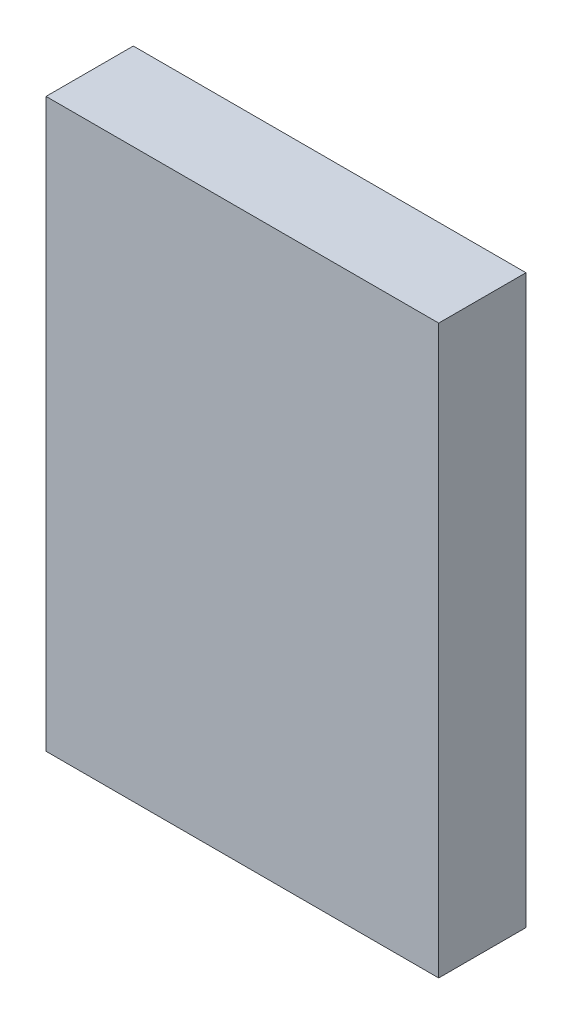
ISO-10303-21;
HEADER;
FILE_DESCRIPTION(('STEP AP214'),'2;1');
FILE_NAME('part.step','',(''),(''),'','','');
FILE_SCHEMA(('AUTOMOTIVE_DESIGN { 1 0 10303 214 1 1 1 1 }'));
ENDSEC;
DATA;
#1=APPLICATION_CONTEXT('core data for automotive mechanical design processes');
#2=APPLICATION_PROTOCOL_DEFINITION('international standard','automotive_design',2000,#1);
#3=PRODUCT_CONTEXT('',#1,'mechanical');
#4=PRODUCT('Part','Part','',(#3));
#5=PRODUCT_RELATED_PRODUCT_CATEGORY('part','',(#4));
#6=PRODUCT_DEFINITION_FORMATION('','',#4);
#7=PRODUCT_DEFINITION_CONTEXT('part definition',#1,'design');
#8=PRODUCT_DEFINITION('design','',#6,#7);
#9=PRODUCT_DEFINITION_SHAPE('','',#8);
#10=(LENGTH_UNIT() NAMED_UNIT(*) SI_UNIT(.MILLI.,.METRE.));
#11=(NAMED_UNIT(*) PLANE_ANGLE_UNIT() SI_UNIT($,.RADIAN.));
#12=(NAMED_UNIT(*) SI_UNIT($,.STERADIAN.) SOLID_ANGLE_UNIT());
#13=UNCERTAINTY_MEASURE_WITH_UNIT(LENGTH_MEASURE(1.E-05),#10,'distance_accuracy_value','');
#14=(GEOMETRIC_REPRESENTATION_CONTEXT(3) GLOBAL_UNCERTAINTY_ASSIGNED_CONTEXT((#13)) GLOBAL_UNIT_ASSIGNED_CONTEXT((#10,
#11,#12)) REPRESENTATION_CONTEXT('',''));
#15=CARTESIAN_POINT('',(0.,0.,0.));
#16=DIRECTION('',(0.,0.,1.));
#17=DIRECTION('',(1.,0.,0.));
#18=AXIS2_PLACEMENT_3D('',#15,#16,#17);
#19=CARTESIAN_POINT('',(28.575,41.275,12.7));
#20=DIRECTION('',(-1.,0.,0.));
#21=DIRECTION('',(0.,-1.,0.));
#22=AXIS2_PLACEMENT_3D('',#19,#20,#21);
#23=PLANE('',#22);
#24=DIRECTION('',(0.,1.,0.));
#25=VECTOR('',#24,1.);
#26=CARTESIAN_POINT('',(28.575,41.275,0.));
#27=LINE('',#26,#25);
#28=CARTESIAN_POINT('',(28.575,-41.275,0.));
#29=VERTEX_POINT('',#28);
#30=CARTESIAN_POINT('',(28.575,41.275,0.));
#31=VERTEX_POINT('',#30);
#32=EDGE_CURVE('E107',#29,#31,#27,.T.);
#33=ORIENTED_EDGE('',*,*,#32,.T.);
#34=DIRECTION('',(0.,0.,-1.));
#35=VECTOR('',#34,1.);
#36=CARTESIAN_POINT('',(28.575,41.275,12.7));
#37=LINE('',#36,#35);
#38=CARTESIAN_POINT('',(28.575,41.275,12.7));
#39=VERTEX_POINT('',#38);
#40=EDGE_CURVE('E11',#39,#31,#37,.T.);
#41=ORIENTED_EDGE('',*,*,#40,.F.);
#42=DIRECTION('',(0.,1.,0.));
#43=VECTOR('',#42,1.);
#44=CARTESIAN_POINT('',(28.575,41.275,12.7));
#45=LINE('',#44,#43);
#46=CARTESIAN_POINT('',(28.575,-41.275,12.7));
#47=VERTEX_POINT('',#46);
#48=EDGE_CURVE('E91',#47,#39,#45,.T.);
#49=ORIENTED_EDGE('',*,*,#48,.F.);
#50=DIRECTION('',(0.,0.,-1.));
#51=VECTOR('',#50,1.);
#52=CARTESIAN_POINT('',(28.575,-41.275,12.7));
#53=LINE('',#52,#51);
#54=EDGE_CURVE('E103',#47,#29,#53,.T.);
#55=ORIENTED_EDGE('',*,*,#54,.T.);
#56=EDGE_LOOP('',(#33,#41,#49,#55));
#57=FACE_BOUND('',#56,.T.);
#58=ADVANCED_FACE('F39',(#57),#23,.F.);
#59=CARTESIAN_POINT('',(-28.575,41.275,12.7));
#60=DIRECTION('',(0.,-1.,0.));
#61=DIRECTION('',(0.,0.,-1.));
#62=AXIS2_PLACEMENT_3D('',#59,#60,#61);
#63=PLANE('',#62);
#64=DIRECTION('',(-1.,0.,0.));
#65=VECTOR('',#64,1.);
#66=CARTESIAN_POINT('',(-28.575,41.275,0.));
#67=LINE('',#66,#65);
#68=CARTESIAN_POINT('',(-28.575,41.275,0.));
#69=VERTEX_POINT('',#68);
#70=EDGE_CURVE('E96',#31,#69,#67,.T.);
#71=ORIENTED_EDGE('',*,*,#70,.T.);
#72=DIRECTION('',(0.,0.,-1.));
#73=VECTOR('',#72,1.);
#74=CARTESIAN_POINT('',(-28.575,41.275,12.7));
#75=LINE('',#74,#73);
#76=CARTESIAN_POINT('',(-28.575,41.275,12.7));
#77=VERTEX_POINT('',#76);
#78=EDGE_CURVE('E48',#77,#69,#75,.T.);
#79=ORIENTED_EDGE('',*,*,#78,.F.);
#80=DIRECTION('',(-1.,0.,0.));
#81=VECTOR('',#80,1.);
#82=CARTESIAN_POINT('',(-28.575,41.275,12.7));
#83=LINE('',#82,#81);
#84=EDGE_CURVE('E86',#39,#77,#83,.T.);
#85=ORIENTED_EDGE('',*,*,#84,.F.);
#86=ORIENTED_EDGE('',*,*,#40,.T.);
#87=EDGE_LOOP('',(#71,#79,#85,#86));
#88=FACE_BOUND('',#87,.T.);
#89=ADVANCED_FACE('F95',(#88),#63,.F.);
#90=CARTESIAN_POINT('',(-28.575,41.275,12.7));
#91=DIRECTION('',(1.,0.,0.));
#92=DIRECTION('',(0.,1.,0.));
#93=AXIS2_PLACEMENT_3D('',#90,#91,#92);
#94=PLANE('',#93);
#95=DIRECTION('',(0.,-1.,0.));
#96=VECTOR('',#95,1.);
#97=CARTESIAN_POINT('',(-28.575,41.275,0.));
#98=LINE('',#97,#96);
#99=CARTESIAN_POINT('',(-28.575,-41.275,0.));
#100=VERTEX_POINT('',#99);
#101=EDGE_CURVE('E73',#69,#100,#98,.T.);
#102=ORIENTED_EDGE('',*,*,#101,.T.);
#103=DIRECTION('',(0.,0.,-1.));
#104=VECTOR('',#103,1.);
#105=CARTESIAN_POINT('',(-28.575,-41.275,12.7));
#106=LINE('',#105,#104);
#107=CARTESIAN_POINT('',(-28.575,-41.275,12.7));
#108=VERTEX_POINT('',#107);
#109=EDGE_CURVE('E98',#108,#100,#106,.T.);
#110=ORIENTED_EDGE('',*,*,#109,.F.);
#111=DIRECTION('',(0.,-1.,0.));
#112=VECTOR('',#111,1.);
#113=CARTESIAN_POINT('',(-28.575,41.275,12.7));
#114=LINE('',#113,#112);
#115=EDGE_CURVE('E89',#77,#108,#114,.T.);
#116=ORIENTED_EDGE('',*,*,#115,.F.);
#117=ORIENTED_EDGE('',*,*,#78,.T.);
#118=EDGE_LOOP('',(#102,#110,#116,#117));
#119=FACE_BOUND('',#118,.T.);
#120=ADVANCED_FACE('F99',(#119),#94,.F.);
#121=CARTESIAN_POINT('',(-28.575,-41.275,12.7));
#122=DIRECTION('',(0.,1.,0.));
#123=DIRECTION('',(0.,0.,1.));
#124=AXIS2_PLACEMENT_3D('',#121,#122,#123);
#125=PLANE('',#124);
#126=DIRECTION('',(1.,0.,0.));
#127=VECTOR('',#126,1.);
#128=CARTESIAN_POINT('',(-28.575,-41.275,0.));
#129=LINE('',#128,#127);
#130=EDGE_CURVE('E79',#100,#29,#129,.T.);
#131=ORIENTED_EDGE('',*,*,#130,.T.);
#132=ORIENTED_EDGE('',*,*,#54,.F.);
#133=DIRECTION('',(1.,0.,0.));
#134=VECTOR('',#133,1.);
#135=CARTESIAN_POINT('',(-28.575,-41.275,12.7));
#136=LINE('',#135,#134);
#137=EDGE_CURVE('E56',#108,#47,#136,.T.);
#138=ORIENTED_EDGE('',*,*,#137,.F.);
#139=ORIENTED_EDGE('',*,*,#109,.T.);
#140=EDGE_LOOP('',(#131,#132,#138,#139));
#141=FACE_BOUND('',#140,.T.);
#142=ADVANCED_FACE('F120',(#141),#125,.F.);
#143=CARTESIAN_POINT('',(0.,0.,12.7));
#144=DIRECTION('',(0.,0.,1.));
#145=DIRECTION('',(1.,0.,0.));
#146=AXIS2_PLACEMENT_3D('',#143,#144,#145);
#147=PLANE('',#146);
#148=ORIENTED_EDGE('',*,*,#48,.T.);
#149=ORIENTED_EDGE('',*,*,#84,.T.);
#150=ORIENTED_EDGE('',*,*,#115,.T.);
#151=ORIENTED_EDGE('',*,*,#137,.T.);
#152=EDGE_LOOP('',(#148,#149,#150,#151));
#153=FACE_BOUND('',#152,.T.);
#154=ADVANCED_FACE('F87',(#153),#147,.T.);
#155=CARTESIAN_POINT('',(0.,0.,0.));
#156=DIRECTION('',(0.,0.,1.));
#157=DIRECTION('',(1.,0.,0.));
#158=AXIS2_PLACEMENT_3D('',#155,#156,#157);
#159=PLANE('',#158);
#160=ORIENTED_EDGE('',*,*,#32,.F.);
#161=ORIENTED_EDGE('',*,*,#130,.F.);
#162=ORIENTED_EDGE('',*,*,#101,.F.);
#163=ORIENTED_EDGE('',*,*,#70,.F.);
#164=EDGE_LOOP('',(#160,#161,#162,#163));
#165=FACE_BOUND('',#164,.T.);
#166=ADVANCED_FACE('F123',(#165),#159,.F.);
#167=CLOSED_SHELL('',(#58,#89,#120,#142,#154,#166));
#168=MANIFOLD_SOLID_BREP('B2',#167);
#169=ADVANCED_BREP_SHAPE_REPRESENTATION('',(#18,#168),#14);
#170=SHAPE_DEFINITION_REPRESENTATION(#9,#169);
ENDSEC;
END-ISO-10303-21;
